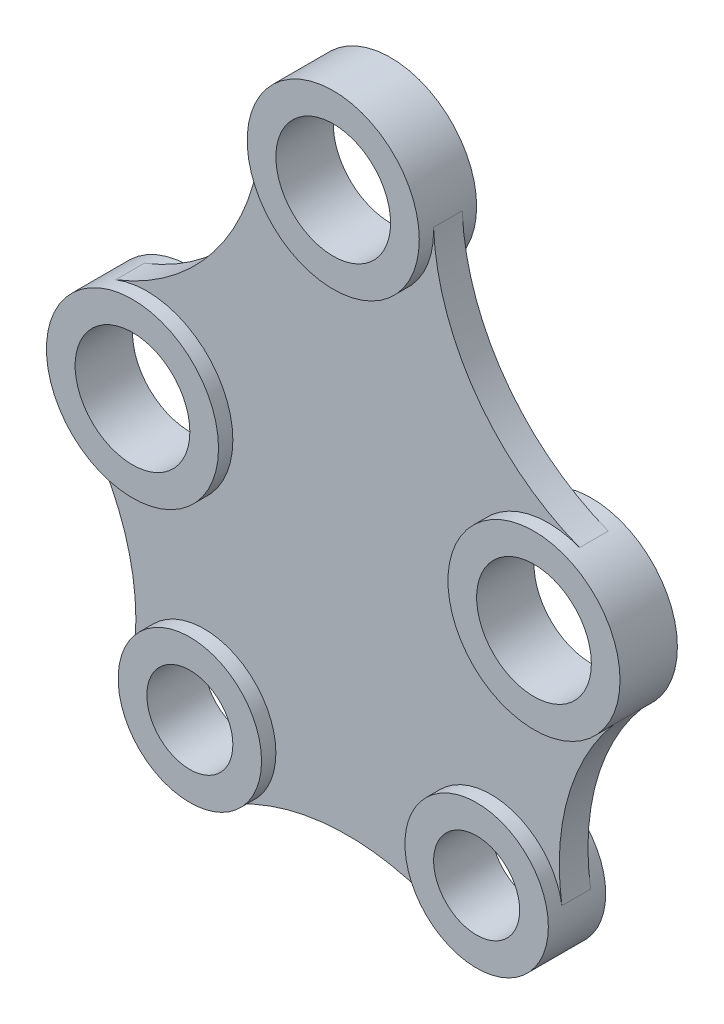
ISO-10303-21;
HEADER;
FILE_DESCRIPTION(('STEP AP214'),'2;1');
FILE_NAME('part.step','',(''),(''),'','','');
FILE_SCHEMA(('AUTOMOTIVE_DESIGN { 1 0 10303 214 1 1 1 1 }'));
ENDSEC;
DATA;
#1=APPLICATION_CONTEXT('core data for automotive mechanical design processes');
#2=APPLICATION_PROTOCOL_DEFINITION('international standard','automotive_design',2000,#1);
#3=PRODUCT_CONTEXT('',#1,'mechanical');
#4=PRODUCT('Part','Part','',(#3));
#5=PRODUCT_RELATED_PRODUCT_CATEGORY('part','',(#4));
#6=PRODUCT_DEFINITION_FORMATION('','',#4);
#7=PRODUCT_DEFINITION_CONTEXT('part definition',#1,'design');
#8=PRODUCT_DEFINITION('design','',#6,#7);
#9=PRODUCT_DEFINITION_SHAPE('','',#8);
#10=(LENGTH_UNIT() NAMED_UNIT(*) SI_UNIT(.MILLI.,.METRE.));
#11=(NAMED_UNIT(*) PLANE_ANGLE_UNIT() SI_UNIT($,.RADIAN.));
#12=(NAMED_UNIT(*) SI_UNIT($,.STERADIAN.) SOLID_ANGLE_UNIT());
#13=UNCERTAINTY_MEASURE_WITH_UNIT(LENGTH_MEASURE(1.E-05),#10,'distance_accuracy_value','');
#14=(GEOMETRIC_REPRESENTATION_CONTEXT(3) GLOBAL_UNCERTAINTY_ASSIGNED_CONTEXT((#13)) GLOBAL_UNIT_ASSIGNED_CONTEXT((#10,
#11,#12)) REPRESENTATION_CONTEXT('',''));
#15=CARTESIAN_POINT('',(0.,0.,0.));
#16=DIRECTION('',(0.,0.,1.));
#17=DIRECTION('',(1.,0.,0.));
#18=AXIS2_PLACEMENT_3D('',#15,#16,#17);
#19=CARTESIAN_POINT('',(0.,-179.330926563097,5.));
#20=DIRECTION('',(0.,0.,-1.));
#21=DIRECTION('',(-1.,0.,0.));
#22=AXIS2_PLACEMENT_3D('',#19,#20,#21);
#23=CYLINDRICAL_SURFACE('',#22,80.);
#24=CARTESIAN_POINT('',(0.,-179.330926563097,-5.));
#25=DIRECTION('',(0.,0.,1.));
#26=DIRECTION('',(1.,0.,0.));
#27=AXIS2_PLACEMENT_3D('',#24,#25,#26);
#28=CIRCLE('',#27,80.);
#29=CARTESIAN_POINT('',(-38.0952380952381,-108.983553943594,-5.));
#30=VERTEX_POINT('',#29);
#31=CARTESIAN_POINT('',(38.0952380952381,-108.983553943594,-5.));
#32=VERTEX_POINT('',#31);
#33=EDGE_CURVE('E131',#30,#32,#28,.F.);
#34=ORIENTED_EDGE('',*,*,#33,.T.);
#35=DIRECTION('',(0.,0.,-1.));
#36=VECTOR('',#35,1.);
#37=CARTESIAN_POINT('',(38.0952380952381,-108.983553943594,5.));
#38=LINE('',#37,#36);
#39=CARTESIAN_POINT('',(38.0952380952381,-108.983553943594,5.));
#40=VERTEX_POINT('',#39);
#41=EDGE_CURVE('E11',#40,#32,#38,.T.);
#42=ORIENTED_EDGE('',*,*,#41,.F.);
#43=CARTESIAN_POINT('',(0.,-179.330926563097,5.));
#44=DIRECTION('',(0.,0.,1.));
#45=DIRECTION('',(1.,0.,0.));
#46=AXIS2_PLACEMENT_3D('',#43,#44,#45);
#47=CIRCLE('',#46,80.);
#48=CARTESIAN_POINT('',(-38.0952380952381,-108.983553943594,5.));
#49=VERTEX_POINT('',#48);
#50=EDGE_CURVE('E162',#49,#40,#47,.F.);
#51=ORIENTED_EDGE('',*,*,#50,.F.);
#52=DIRECTION('',(0.,0.,-1.));
#53=VECTOR('',#52,1.);
#54=CARTESIAN_POINT('',(-38.0952380952381,-108.983553943594,5.));
#55=LINE('',#54,#53);
#56=EDGE_CURVE('E163',#49,#30,#55,.T.);
#57=ORIENTED_EDGE('',*,*,#56,.T.);
#58=EDGE_LOOP('',(#34,#42,#51,#57));
#59=FACE_BOUND('',#58,.T.);
#60=ADVANCED_FACE('F36',(#59),#23,.F.);
#61=CARTESIAN_POINT('',(153.811109020668,-71.2439331081997,5.));
#62=DIRECTION('',(0.,0.,-1.));
#63=DIRECTION('',(-1.,0.,0.));
#64=AXIS2_PLACEMENT_3D('',#61,#62,#63);
#65=CYLINDRICAL_SURFACE('',#64,80.);
#66=CARTESIAN_POINT('',(153.811109020668,-71.2439331081997,-5.));
#67=DIRECTION('',(0.,0.,1.));
#68=DIRECTION('',(1.,0.,0.));
#69=AXIS2_PLACEMENT_3D('',#66,#67,#68);
#70=CIRCLE('',#69,80.);
#71=CARTESIAN_POINT('',(92.8575751874551,-19.4301635749635,-5.));
#72=VERTEX_POINT('',#71);
#73=CARTESIAN_POINT('',(74.7169307192068,-83.2485555019523,-5.));
#74=VERTEX_POINT('',#73);
#75=EDGE_CURVE('E130',#72,#74,#70,.T.);
#76=ORIENTED_EDGE('',*,*,#75,.F.);
#77=DIRECTION('',(0.,0.,-1.));
#78=VECTOR('',#77,1.);
#79=CARTESIAN_POINT('',(92.8575751874551,-19.4301635749635,5.));
#80=LINE('',#79,#78);
#81=CARTESIAN_POINT('',(92.8575751874551,-19.4301635749636,5.));
#82=VERTEX_POINT('',#81);
#83=EDGE_CURVE('E141',#82,#72,#80,.T.);
#84=ORIENTED_EDGE('',*,*,#83,.F.);
#85=CARTESIAN_POINT('',(153.811109020668,-71.2439331081997,5.));
#86=DIRECTION('',(0.,0.,1.));
#87=DIRECTION('',(1.,0.,0.));
#88=AXIS2_PLACEMENT_3D('',#85,#86,#87);
#89=CIRCLE('',#88,80.);
#90=CARTESIAN_POINT('',(74.7169307192068,-83.2485555019523,5.));
#91=VERTEX_POINT('',#90);
#92=EDGE_CURVE('E140',#82,#91,#89,.T.);
#93=ORIENTED_EDGE('',*,*,#92,.T.);
#94=DIRECTION('',(0.,0.,-1.));
#95=VECTOR('',#94,1.);
#96=CARTESIAN_POINT('',(74.7169307192068,-83.2485555019523,5.));
#97=LINE('',#96,#95);
#98=EDGE_CURVE('E44',#91,#74,#97,.T.);
#99=ORIENTED_EDGE('',*,*,#98,.T.);
#100=EDGE_LOOP('',(#76,#84,#93,#99));
#101=FACE_BOUND('',#100,.T.);
#102=ADVANCED_FACE('F136',(#101),#65,.F.);
#103=CARTESIAN_POINT('',(109.907690941332,102.505493529523,5.));
#104=DIRECTION('',(0.,0.,-1.));
#105=DIRECTION('',(-1.,0.,0.));
#106=AXIS2_PLACEMENT_3D('',#103,#104,#105);
#107=CYLINDRICAL_SURFACE('',#106,80.);
#108=CARTESIAN_POINT('',(109.907690941332,102.505493529523,-5.));
#109=DIRECTION('',(0.,0.,1.));
#110=DIRECTION('',(1.,0.,0.));
#111=AXIS2_PLACEMENT_3D('',#108,#109,#110);
#112=CIRCLE('',#111,80.);
#113=CARTESIAN_POINT('',(29.9748248021815,99.2287709625972,-5.));
#114=VERTEX_POINT('',#113);
#115=CARTESIAN_POINT('',(80.8839157112725,27.9560436898699,-5.));
#116=VERTEX_POINT('',#115);
#117=EDGE_CURVE('E146',#114,#116,#112,.T.);
#118=ORIENTED_EDGE('',*,*,#117,.F.);
#119=DIRECTION('',(0.,0.,-1.));
#120=VECTOR('',#119,1.);
#121=CARTESIAN_POINT('',(29.9748248021815,99.2287709625972,5.));
#122=LINE('',#121,#120);
#123=CARTESIAN_POINT('',(29.9748248021815,99.2287709625972,5.));
#124=VERTEX_POINT('',#123);
#125=EDGE_CURVE('E176',#124,#114,#122,.T.);
#126=ORIENTED_EDGE('',*,*,#125,.F.);
#127=CARTESIAN_POINT('',(109.907690941332,102.505493529523,5.));
#128=DIRECTION('',(0.,0.,1.));
#129=DIRECTION('',(1.,0.,0.));
#130=AXIS2_PLACEMENT_3D('',#127,#128,#129);
#131=CIRCLE('',#130,80.);
#132=CARTESIAN_POINT('',(80.8839157112725,27.9560436898699,5.));
#133=VERTEX_POINT('',#132);
#134=EDGE_CURVE('E191',#124,#133,#131,.T.);
#135=ORIENTED_EDGE('',*,*,#134,.T.);
#136=DIRECTION('',(0.,0.,-1.));
#137=VECTOR('',#136,1.);
#138=CARTESIAN_POINT('',(80.8839157112725,27.9560436898699,5.));
#139=LINE('',#138,#137);
#140=EDGE_CURVE('E178',#133,#116,#139,.T.);
#141=ORIENTED_EDGE('',*,*,#140,.T.);
#142=EDGE_LOOP('',(#118,#126,#135,#141));
#143=FACE_BOUND('',#142,.T.);
#144=ADVANCED_FACE('F226',(#143),#107,.F.);
#145=CARTESIAN_POINT('',(-109.907690941332,102.505493529523,5.));
#146=DIRECTION('',(0.,0.,-1.));
#147=DIRECTION('',(-1.,0.,0.));
#148=AXIS2_PLACEMENT_3D('',#145,#146,#147);
#149=CYLINDRICAL_SURFACE('',#148,80.);
#150=CARTESIAN_POINT('',(-109.907690941332,102.505493529523,-5.));
#151=DIRECTION('',(0.,0.,1.));
#152=DIRECTION('',(1.,0.,0.));
#153=AXIS2_PLACEMENT_3D('',#150,#151,#152);
#154=CIRCLE('',#153,80.);
#155=CARTESIAN_POINT('',(-29.9748248021815,99.2287709625972,-5.));
#156=VERTEX_POINT('',#155);
#157=CARTESIAN_POINT('',(-80.8839157112725,27.9560436898699,-5.));
#158=VERTEX_POINT('',#157);
#159=EDGE_CURVE('E72',#156,#158,#154,.F.);
#160=ORIENTED_EDGE('',*,*,#159,.T.);
#161=DIRECTION('',(0.,0.,-1.));
#162=VECTOR('',#161,1.);
#163=CARTESIAN_POINT('',(-80.8839157112725,27.9560436898699,5.));
#164=LINE('',#163,#162);
#165=CARTESIAN_POINT('',(-80.8839157112725,27.9560436898699,5.));
#166=VERTEX_POINT('',#165);
#167=EDGE_CURVE('E171',#166,#158,#164,.T.);
#168=ORIENTED_EDGE('',*,*,#167,.F.);
#169=CARTESIAN_POINT('',(-109.907690941332,102.505493529523,5.));
#170=DIRECTION('',(0.,0.,1.));
#171=DIRECTION('',(1.,0.,0.));
#172=AXIS2_PLACEMENT_3D('',#169,#170,#171);
#173=CIRCLE('',#172,80.);
#174=CARTESIAN_POINT('',(-29.9748248021815,99.2287709625972,5.));
#175=VERTEX_POINT('',#174);
#176=EDGE_CURVE('E87',#175,#166,#173,.F.);
#177=ORIENTED_EDGE('',*,*,#176,.F.);
#178=DIRECTION('',(0.,0.,-1.));
#179=VECTOR('',#178,1.);
#180=CARTESIAN_POINT('',(-29.9748248021815,99.2287709625972,5.));
#181=LINE('',#180,#179);
#182=EDGE_CURVE('E174',#175,#156,#181,.T.);
#183=ORIENTED_EDGE('',*,*,#182,.T.);
#184=EDGE_LOOP('',(#160,#168,#177,#183));
#185=FACE_BOUND('',#184,.T.);
#186=ADVANCED_FACE('F230',(#185),#149,.F.);
#187=CARTESIAN_POINT('',(-153.811109020668,-71.2439331081997,5.));
#188=DIRECTION('',(0.,0.,-1.));
#189=DIRECTION('',(-1.,0.,0.));
#190=AXIS2_PLACEMENT_3D('',#187,#188,#189);
#191=CYLINDRICAL_SURFACE('',#190,80.);
#192=CARTESIAN_POINT('',(-153.811109020668,-71.2439331081997,-5.));
#193=DIRECTION('',(0.,0.,1.));
#194=DIRECTION('',(1.,0.,0.));
#195=AXIS2_PLACEMENT_3D('',#192,#193,#194);
#196=CIRCLE('',#195,80.);
#197=CARTESIAN_POINT('',(-92.8575751874551,-19.4301635749635,-5.));
#198=VERTEX_POINT('',#197);
#199=CARTESIAN_POINT('',(-74.7169307192068,-83.2485555019523,-5.));
#200=VERTEX_POINT('',#199);
#201=EDGE_CURVE('E80',#198,#200,#196,.F.);
#202=ORIENTED_EDGE('',*,*,#201,.T.);
#203=DIRECTION('',(0.,0.,-1.));
#204=VECTOR('',#203,1.);
#205=CARTESIAN_POINT('',(-74.7169307192068,-83.2485555019523,5.));
#206=LINE('',#205,#204);
#207=CARTESIAN_POINT('',(-74.7169307192068,-83.2485555019523,5.));
#208=VERTEX_POINT('',#207);
#209=EDGE_CURVE('E166',#208,#200,#206,.T.);
#210=ORIENTED_EDGE('',*,*,#209,.F.);
#211=CARTESIAN_POINT('',(-153.811109020668,-71.2439331081997,5.));
#212=DIRECTION('',(0.,0.,1.));
#213=DIRECTION('',(1.,0.,0.));
#214=AXIS2_PLACEMENT_3D('',#211,#212,#213);
#215=CIRCLE('',#214,80.);
#216=CARTESIAN_POINT('',(-92.8575751874551,-19.4301635749635,5.));
#217=VERTEX_POINT('',#216);
#218=EDGE_CURVE('E202',#217,#208,#215,.F.);
#219=ORIENTED_EDGE('',*,*,#218,.F.);
#220=DIRECTION('',(0.,0.,-1.));
#221=VECTOR('',#220,1.);
#222=CARTESIAN_POINT('',(-92.8575751874551,-19.4301635749635,5.));
#223=LINE('',#222,#221);
#224=EDGE_CURVE('E169',#217,#198,#223,.T.);
#225=ORIENTED_EDGE('',*,*,#224,.T.);
#226=EDGE_LOOP('',(#202,#210,#219,#225));
#227=FACE_BOUND('',#226,.T.);
#228=ADVANCED_FACE('F236',(#227),#191,.F.);
#229=CARTESIAN_POINT('',(0.,0.,5.));
#230=DIRECTION('',(0.,0.,1.));
#231=DIRECTION('',(1.,0.,0.));
#232=AXIS2_PLACEMENT_3D('',#229,#230,#231);
#233=PLANE('',#232);
#234=ORIENTED_EDGE('',*,*,#50,.T.);
#235=CARTESIAN_POINT('',(50.,-87.,5.));
#236=DIRECTION('',(0.,0.,1.));
#237=DIRECTION('',(1.,0.,0.));
#238=AXIS2_PLACEMENT_3D('',#235,#236,#237);
#239=CIRCLE('',#238,25.);
#240=EDGE_CURVE('E189',#91,#40,#239,.T.);
#241=ORIENTED_EDGE('',*,*,#240,.F.);
#242=ORIENTED_EDGE('',*,*,#92,.F.);
#243=CARTESIAN_POINT('',(70.,0.,5.));
#244=DIRECTION('',(0.,0.,1.));
#245=DIRECTION('',(1.,0.,0.));
#246=AXIS2_PLACEMENT_3D('',#243,#244,#245);
#247=CIRCLE('',#246,30.);
#248=EDGE_CURVE('E185',#133,#82,#247,.T.);
#249=ORIENTED_EDGE('',*,*,#248,.F.);
#250=ORIENTED_EDGE('',*,*,#134,.F.);
#251=CARTESIAN_POINT('',(0.,98.,5.));
#252=DIRECTION('',(0.,0.,1.));
#253=DIRECTION('',(1.,0.,0.));
#254=AXIS2_PLACEMENT_3D('',#251,#252,#253);
#255=CIRCLE('',#254,30.);
#256=EDGE_CURVE('E197',#175,#124,#255,.T.);
#257=ORIENTED_EDGE('',*,*,#256,.F.);
#258=ORIENTED_EDGE('',*,*,#176,.T.);
#259=CARTESIAN_POINT('',(-70.,0.,5.));
#260=DIRECTION('',(0.,0.,1.));
#261=DIRECTION('',(1.,0.,0.));
#262=AXIS2_PLACEMENT_3D('',#259,#260,#261);
#263=CIRCLE('',#262,30.);
#264=EDGE_CURVE('E200',#166,#217,#263,.F.);
#265=ORIENTED_EDGE('',*,*,#264,.T.);
#266=ORIENTED_EDGE('',*,*,#218,.T.);
#267=CARTESIAN_POINT('',(-50.,-87.,5.));
#268=DIRECTION('',(0.,0.,1.));
#269=DIRECTION('',(1.,0.,0.));
#270=AXIS2_PLACEMENT_3D('',#267,#268,#269);
#271=CIRCLE('',#270,25.);
#272=EDGE_CURVE('E52',#208,#49,#271,.F.);
#273=ORIENTED_EDGE('',*,*,#272,.T.);
#274=EDGE_LOOP('',(#234,#241,#242,#249,#250,#257,#258,#265,#266,#273));
#275=FACE_BOUND('',#274,.T.);
#276=ADVANCED_FACE('F186',(#275),#233,.T.);
#277=CARTESIAN_POINT('',(0.,0.,-5.));
#278=DIRECTION('',(0.,0.,1.));
#279=DIRECTION('',(1.,0.,0.));
#280=AXIS2_PLACEMENT_3D('',#277,#278,#279);
#281=PLANE('',#280);
#282=ORIENTED_EDGE('',*,*,#33,.F.);
#283=CARTESIAN_POINT('',(-50.,-87.,-5.));
#284=DIRECTION('',(0.,0.,1.));
#285=DIRECTION('',(1.,0.,0.));
#286=AXIS2_PLACEMENT_3D('',#283,#284,#285);
#287=CIRCLE('',#286,25.);
#288=EDGE_CURVE('E159',#200,#30,#287,.F.);
#289=ORIENTED_EDGE('',*,*,#288,.F.);
#290=ORIENTED_EDGE('',*,*,#201,.F.);
#291=CARTESIAN_POINT('',(-70.,0.,-5.));
#292=DIRECTION('',(0.,0.,1.));
#293=DIRECTION('',(1.,0.,0.));
#294=AXIS2_PLACEMENT_3D('',#291,#292,#293);
#295=CIRCLE('',#294,30.);
#296=EDGE_CURVE('E155',#158,#198,#295,.F.);
#297=ORIENTED_EDGE('',*,*,#296,.F.);
#298=ORIENTED_EDGE('',*,*,#159,.F.);
#299=CARTESIAN_POINT('',(0.,98.,-5.));
#300=DIRECTION('',(0.,0.,1.));
#301=DIRECTION('',(1.,0.,0.));
#302=AXIS2_PLACEMENT_3D('',#299,#300,#301);
#303=CIRCLE('',#302,30.);
#304=EDGE_CURVE('E151',#156,#114,#303,.T.);
#305=ORIENTED_EDGE('',*,*,#304,.T.);
#306=ORIENTED_EDGE('',*,*,#117,.T.);
#307=CARTESIAN_POINT('',(70.,0.,-5.));
#308=DIRECTION('',(0.,0.,1.));
#309=DIRECTION('',(1.,0.,0.));
#310=AXIS2_PLACEMENT_3D('',#307,#308,#309);
#311=CIRCLE('',#310,30.);
#312=EDGE_CURVE('E144',#116,#72,#311,.T.);
#313=ORIENTED_EDGE('',*,*,#312,.T.);
#314=ORIENTED_EDGE('',*,*,#75,.T.);
#315=CARTESIAN_POINT('',(50.,-87.,-5.));
#316=DIRECTION('',(0.,0.,1.));
#317=DIRECTION('',(1.,0.,0.));
#318=AXIS2_PLACEMENT_3D('',#315,#316,#317);
#319=CIRCLE('',#318,25.);
#320=EDGE_CURVE('E121',#74,#32,#319,.T.);
#321=ORIENTED_EDGE('',*,*,#320,.T.);
#322=EDGE_LOOP('',(#282,#289,#290,#297,#298,#305,#306,#313,#314,#321));
#323=FACE_BOUND('',#322,.T.);
#324=ADVANCED_FACE('F142',(#323),#281,.F.);
#325=CARTESIAN_POINT('',(0.,98.,10.));
#326=DIRECTION('',(0.,0.,-1.));
#327=DIRECTION('',(-1.,0.,0.));
#328=AXIS2_PLACEMENT_3D('',#325,#326,#327);
#329=CYLINDRICAL_SURFACE('',#328,20.);
#330=CARTESIAN_POINT('',(0.,98.,10.));
#331=DIRECTION('',(0.,0.,1.));
#332=DIRECTION('',(1.,0.,0.));
#333=AXIS2_PLACEMENT_3D('',#330,#331,#332);
#334=CIRCLE('',#333,20.);
#335=CARTESIAN_POINT('',(20.,98.,10.));
#336=VERTEX_POINT('',#335);
#337=EDGE_CURVE('E207',#336,#336,#334,.T.);
#338=ORIENTED_EDGE('',*,*,#337,.T.);
#339=EDGE_LOOP('',(#338));
#340=FACE_BOUND('',#339,.T.);
#341=CARTESIAN_POINT('',(0.,98.,-10.));
#342=DIRECTION('',(0.,0.,1.));
#343=DIRECTION('',(1.,0.,0.));
#344=AXIS2_PLACEMENT_3D('',#341,#342,#343);
#345=CIRCLE('',#344,20.);
#346=CARTESIAN_POINT('',(20.,98.,-10.));
#347=VERTEX_POINT('',#346);
#348=EDGE_CURVE('E216',#347,#347,#345,.T.);
#349=ORIENTED_EDGE('',*,*,#348,.F.);
#350=EDGE_LOOP('',(#349));
#351=FACE_BOUND('',#350,.T.);
#352=ADVANCED_FACE('F241',(#340,#351),#329,.F.);
#353=CARTESIAN_POINT('',(0.,98.,10.));
#354=DIRECTION('',(0.,0.,-1.));
#355=DIRECTION('',(-1.,0.,0.));
#356=AXIS2_PLACEMENT_3D('',#353,#354,#355);
#357=CYLINDRICAL_SURFACE('',#356,30.);
#358=ORIENTED_EDGE('',*,*,#256,.T.);
#359=ORIENTED_EDGE('',*,*,#125,.T.);
#360=ORIENTED_EDGE('',*,*,#304,.F.);
#361=ORIENTED_EDGE('',*,*,#182,.F.);
#362=EDGE_LOOP('',(#358,#359,#360,#361));
#363=FACE_BOUND('',#362,.T.);
#364=CARTESIAN_POINT('',(0.,98.,10.));
#365=DIRECTION('',(0.,0.,1.));
#366=DIRECTION('',(1.,0.,0.));
#367=AXIS2_PLACEMENT_3D('',#364,#365,#366);
#368=CIRCLE('',#367,30.);
#369=CARTESIAN_POINT('',(30.,98.,10.));
#370=VERTEX_POINT('',#369);
#371=EDGE_CURVE('E204',#370,#370,#368,.T.);
#372=ORIENTED_EDGE('',*,*,#371,.F.);
#373=EDGE_LOOP('',(#372));
#374=FACE_BOUND('',#373,.T.);
#375=CARTESIAN_POINT('',(0.,98.,-10.));
#376=DIRECTION('',(0.,0.,1.));
#377=DIRECTION('',(1.,0.,0.));
#378=AXIS2_PLACEMENT_3D('',#375,#376,#377);
#379=CIRCLE('',#378,30.);
#380=CARTESIAN_POINT('',(30.,98.,-10.));
#381=VERTEX_POINT('',#380);
#382=EDGE_CURVE('E212',#381,#381,#379,.T.);
#383=ORIENTED_EDGE('',*,*,#382,.T.);
#384=EDGE_LOOP('',(#383));
#385=FACE_BOUND('',#384,.T.);
#386=ADVANCED_FACE('F246',(#363,#374,#385),#357,.T.);
#387=CARTESIAN_POINT('',(0.,0.,10.));
#388=DIRECTION('',(0.,0.,1.));
#389=DIRECTION('',(1.,0.,0.));
#390=AXIS2_PLACEMENT_3D('',#387,#388,#389);
#391=PLANE('',#390);
#392=ORIENTED_EDGE('',*,*,#337,.F.);
#393=EDGE_LOOP('',(#392));
#394=FACE_BOUND('',#393,.T.);
#395=ORIENTED_EDGE('',*,*,#371,.T.);
#396=EDGE_LOOP('',(#395));
#397=FACE_BOUND('',#396,.T.);
#398=ADVANCED_FACE('F250',(#394,#397),#391,.T.);
#399=CARTESIAN_POINT('',(0.,0.,-10.));
#400=DIRECTION('',(0.,0.,1.));
#401=DIRECTION('',(1.,0.,0.));
#402=AXIS2_PLACEMENT_3D('',#399,#400,#401);
#403=PLANE('',#402);
#404=ORIENTED_EDGE('',*,*,#348,.T.);
#405=EDGE_LOOP('',(#404));
#406=FACE_BOUND('',#405,.T.);
#407=ORIENTED_EDGE('',*,*,#382,.F.);
#408=EDGE_LOOP('',(#407));
#409=FACE_BOUND('',#408,.T.);
#410=ADVANCED_FACE('F252',(#406,#409),#403,.F.);
#411=CARTESIAN_POINT('',(70.,0.,10.));
#412=DIRECTION('',(0.,0.,-1.));
#413=DIRECTION('',(-1.,0.,0.));
#414=AXIS2_PLACEMENT_3D('',#411,#412,#413);
#415=CYLINDRICAL_SURFACE('',#414,20.);
#416=CARTESIAN_POINT('',(70.,0.,10.));
#417=DIRECTION('',(0.,0.,1.));
#418=DIRECTION('',(1.,0.,0.));
#419=AXIS2_PLACEMENT_3D('',#416,#417,#418);
#420=CIRCLE('',#419,20.);
#421=CARTESIAN_POINT('',(90.,0.,10.));
#422=VERTEX_POINT('',#421);
#423=EDGE_CURVE('E361',#422,#422,#420,.T.);
#424=ORIENTED_EDGE('',*,*,#423,.T.);
#425=EDGE_LOOP('',(#424));
#426=FACE_BOUND('',#425,.T.);
#427=CARTESIAN_POINT('',(70.,0.,-10.));
#428=DIRECTION('',(0.,0.,1.));
#429=DIRECTION('',(1.,0.,0.));
#430=AXIS2_PLACEMENT_3D('',#427,#428,#429);
#431=CIRCLE('',#430,20.);
#432=CARTESIAN_POINT('',(90.,0.,-10.));
#433=VERTEX_POINT('',#432);
#434=EDGE_CURVE('E356',#433,#433,#431,.T.);
#435=ORIENTED_EDGE('',*,*,#434,.F.);
#436=EDGE_LOOP('',(#435));
#437=FACE_BOUND('',#436,.T.);
#438=ADVANCED_FACE('F255',(#426,#437),#415,.F.);
#439=CARTESIAN_POINT('',(70.,0.,10.));
#440=DIRECTION('',(0.,0.,-1.));
#441=DIRECTION('',(-1.,0.,0.));
#442=AXIS2_PLACEMENT_3D('',#439,#440,#441);
#443=CYLINDRICAL_SURFACE('',#442,30.);
#444=ORIENTED_EDGE('',*,*,#248,.T.);
#445=ORIENTED_EDGE('',*,*,#83,.T.);
#446=ORIENTED_EDGE('',*,*,#312,.F.);
#447=ORIENTED_EDGE('',*,*,#140,.F.);
#448=EDGE_LOOP('',(#444,#445,#446,#447));
#449=FACE_BOUND('',#448,.T.);
#450=CARTESIAN_POINT('',(70.,0.,10.));
#451=DIRECTION('',(0.,0.,1.));
#452=DIRECTION('',(1.,0.,0.));
#453=AXIS2_PLACEMENT_3D('',#450,#451,#452);
#454=CIRCLE('',#453,30.);
#455=CARTESIAN_POINT('',(100.,0.,10.));
#456=VERTEX_POINT('',#455);
#457=EDGE_CURVE('E219',#456,#456,#454,.T.);
#458=ORIENTED_EDGE('',*,*,#457,.F.);
#459=EDGE_LOOP('',(#458));
#460=FACE_BOUND('',#459,.T.);
#461=CARTESIAN_POINT('',(70.,0.,-10.));
#462=DIRECTION('',(0.,0.,1.));
#463=DIRECTION('',(1.,0.,0.));
#464=AXIS2_PLACEMENT_3D('',#461,#462,#463);
#465=CIRCLE('',#464,30.);
#466=CARTESIAN_POINT('',(100.,0.,-10.));
#467=VERTEX_POINT('',#466);
#468=EDGE_CURVE('E364',#467,#467,#465,.T.);
#469=ORIENTED_EDGE('',*,*,#468,.T.);
#470=EDGE_LOOP('',(#469));
#471=FACE_BOUND('',#470,.T.);
#472=ADVANCED_FACE('F182',(#449,#460,#471),#443,.T.);
#473=CARTESIAN_POINT('',(0.,0.,10.));
#474=DIRECTION('',(0.,0.,1.));
#475=DIRECTION('',(1.,0.,0.));
#476=AXIS2_PLACEMENT_3D('',#473,#474,#475);
#477=PLANE('',#476);
#478=ORIENTED_EDGE('',*,*,#423,.F.);
#479=EDGE_LOOP('',(#478));
#480=FACE_BOUND('',#479,.T.);
#481=ORIENTED_EDGE('',*,*,#457,.T.);
#482=EDGE_LOOP('',(#481));
#483=FACE_BOUND('',#482,.T.);
#484=ADVANCED_FACE('F265',(#480,#483),#477,.T.);
#485=CARTESIAN_POINT('',(0.,0.,-10.));
#486=DIRECTION('',(0.,0.,1.));
#487=DIRECTION('',(1.,0.,0.));
#488=AXIS2_PLACEMENT_3D('',#485,#486,#487);
#489=PLANE('',#488);
#490=ORIENTED_EDGE('',*,*,#434,.T.);
#491=EDGE_LOOP('',(#490));
#492=FACE_BOUND('',#491,.T.);
#493=ORIENTED_EDGE('',*,*,#468,.F.);
#494=EDGE_LOOP('',(#493));
#495=FACE_BOUND('',#494,.T.);
#496=ADVANCED_FACE('F266',(#492,#495),#489,.F.);
#497=CARTESIAN_POINT('',(-70.,0.,10.));
#498=DIRECTION('',(0.,0.,-1.));
#499=DIRECTION('',(-1.,0.,0.));
#500=AXIS2_PLACEMENT_3D('',#497,#498,#499);
#501=CYLINDRICAL_SURFACE('',#500,30.);
#502=ORIENTED_EDGE('',*,*,#224,.F.);
#503=ORIENTED_EDGE('',*,*,#264,.F.);
#504=ORIENTED_EDGE('',*,*,#167,.T.);
#505=ORIENTED_EDGE('',*,*,#296,.T.);
#506=EDGE_LOOP('',(#502,#503,#504,#505));
#507=FACE_BOUND('',#506,.T.);
#508=CARTESIAN_POINT('',(-70.,0.,10.));
#509=DIRECTION('',(0.,0.,1.));
#510=DIRECTION('',(1.,0.,0.));
#511=AXIS2_PLACEMENT_3D('',#508,#509,#510);
#512=CIRCLE('',#511,30.);
#513=CARTESIAN_POINT('',(-40.,0.,10.));
#514=VERTEX_POINT('',#513);
#515=EDGE_CURVE('E349',#514,#514,#512,.F.);
#516=ORIENTED_EDGE('',*,*,#515,.T.);
#517=EDGE_LOOP('',(#516));
#518=FACE_BOUND('',#517,.T.);
#519=CARTESIAN_POINT('',(-70.,0.,-10.));
#520=DIRECTION('',(0.,0.,1.));
#521=DIRECTION('',(1.,0.,0.));
#522=AXIS2_PLACEMENT_3D('',#519,#520,#521);
#523=CIRCLE('',#522,30.);
#524=CARTESIAN_POINT('',(-40.,0.,-10.));
#525=VERTEX_POINT('',#524);
#526=EDGE_CURVE('E345',#525,#525,#523,.F.);
#527=ORIENTED_EDGE('',*,*,#526,.F.);
#528=EDGE_LOOP('',(#527));
#529=FACE_BOUND('',#528,.T.);
#530=ADVANCED_FACE('F269',(#507,#518,#529),#501,.T.);
#531=CARTESIAN_POINT('',(-70.,0.,10.));
#532=DIRECTION('',(0.,0.,-1.));
#533=DIRECTION('',(-1.,0.,0.));
#534=AXIS2_PLACEMENT_3D('',#531,#532,#533);
#535=CYLINDRICAL_SURFACE('',#534,20.);
#536=CARTESIAN_POINT('',(-70.,0.,10.));
#537=DIRECTION('',(0.,0.,1.));
#538=DIRECTION('',(1.,0.,0.));
#539=AXIS2_PLACEMENT_3D('',#536,#537,#538);
#540=CIRCLE('',#539,20.);
#541=CARTESIAN_POINT('',(-50.,0.,10.));
#542=VERTEX_POINT('',#541);
#543=EDGE_CURVE('E352',#542,#542,#540,.F.);
#544=ORIENTED_EDGE('',*,*,#543,.F.);
#545=EDGE_LOOP('',(#544));
#546=FACE_BOUND('',#545,.T.);
#547=CARTESIAN_POINT('',(-70.,0.,-10.));
#548=DIRECTION('',(0.,0.,1.));
#549=DIRECTION('',(1.,0.,0.));
#550=AXIS2_PLACEMENT_3D('',#547,#548,#549);
#551=CIRCLE('',#550,20.);
#552=CARTESIAN_POINT('',(-50.,0.,-10.));
#553=VERTEX_POINT('',#552);
#554=EDGE_CURVE('E353',#553,#553,#551,.F.);
#555=ORIENTED_EDGE('',*,*,#554,.T.);
#556=EDGE_LOOP('',(#555));
#557=FACE_BOUND('',#556,.T.);
#558=ADVANCED_FACE('F276',(#546,#557),#535,.F.);
#559=CARTESIAN_POINT('',(0.,0.,10.));
#560=DIRECTION('',(0.,0.,1.));
#561=DIRECTION('',(1.,0.,0.));
#562=AXIS2_PLACEMENT_3D('',#559,#560,#561);
#563=PLANE('',#562);
#564=ORIENTED_EDGE('',*,*,#515,.F.);
#565=EDGE_LOOP('',(#564));
#566=FACE_BOUND('',#565,.T.);
#567=ORIENTED_EDGE('',*,*,#543,.T.);
#568=EDGE_LOOP('',(#567));
#569=FACE_BOUND('',#568,.T.);
#570=ADVANCED_FACE('F280',(#566,#569),#563,.T.);
#571=CARTESIAN_POINT('',(0.,0.,-10.));
#572=DIRECTION('',(0.,0.,1.));
#573=DIRECTION('',(1.,0.,0.));
#574=AXIS2_PLACEMENT_3D('',#571,#572,#573);
#575=PLANE('',#574);
#576=ORIENTED_EDGE('',*,*,#526,.T.);
#577=EDGE_LOOP('',(#576));
#578=FACE_BOUND('',#577,.T.);
#579=ORIENTED_EDGE('',*,*,#554,.F.);
#580=EDGE_LOOP('',(#579));
#581=FACE_BOUND('',#580,.T.);
#582=ADVANCED_FACE('F282',(#578,#581),#575,.F.);
#583=CARTESIAN_POINT('',(-50.,-87.,10.));
#584=DIRECTION('',(0.,0.,-1.));
#585=DIRECTION('',(-1.,0.,0.));
#586=AXIS2_PLACEMENT_3D('',#583,#584,#585);
#587=CYLINDRICAL_SURFACE('',#586,25.);
#588=ORIENTED_EDGE('',*,*,#56,.F.);
#589=ORIENTED_EDGE('',*,*,#272,.F.);
#590=ORIENTED_EDGE('',*,*,#209,.T.);
#591=ORIENTED_EDGE('',*,*,#288,.T.);
#592=EDGE_LOOP('',(#588,#589,#590,#591));
#593=FACE_BOUND('',#592,.T.);
#594=CARTESIAN_POINT('',(-50.,-87.,10.));
#595=DIRECTION('',(0.,0.,1.));
#596=DIRECTION('',(1.,0.,0.));
#597=AXIS2_PLACEMENT_3D('',#594,#595,#596);
#598=CIRCLE('',#597,25.);
#599=CARTESIAN_POINT('',(-25.,-87.,10.));
#600=VERTEX_POINT('',#599);
#601=EDGE_CURVE('E340',#600,#600,#598,.F.);
#602=ORIENTED_EDGE('',*,*,#601,.T.);
#603=EDGE_LOOP('',(#602));
#604=FACE_BOUND('',#603,.T.);
#605=CARTESIAN_POINT('',(-50.,-87.,-10.));
#606=DIRECTION('',(0.,0.,1.));
#607=DIRECTION('',(1.,0.,0.));
#608=AXIS2_PLACEMENT_3D('',#605,#606,#607);
#609=CIRCLE('',#608,25.);
#610=CARTESIAN_POINT('',(-25.,-87.,-10.));
#611=VERTEX_POINT('',#610);
#612=EDGE_CURVE('E327',#611,#611,#609,.F.);
#613=ORIENTED_EDGE('',*,*,#612,.F.);
#614=EDGE_LOOP('',(#613));
#615=FACE_BOUND('',#614,.T.);
#616=ADVANCED_FACE('F285',(#593,#604,#615),#587,.T.);
#617=CARTESIAN_POINT('',(-50.,-87.,10.));
#618=DIRECTION('',(0.,0.,-1.));
#619=DIRECTION('',(-1.,0.,0.));
#620=AXIS2_PLACEMENT_3D('',#617,#618,#619);
#621=CYLINDRICAL_SURFACE('',#620,15.);
#622=CARTESIAN_POINT('',(-50.,-87.,10.));
#623=DIRECTION('',(0.,0.,1.));
#624=DIRECTION('',(1.,0.,0.));
#625=AXIS2_PLACEMENT_3D('',#622,#623,#624);
#626=CIRCLE('',#625,15.);
#627=CARTESIAN_POINT('',(-35.,-87.,10.));
#628=VERTEX_POINT('',#627);
#629=EDGE_CURVE('E343',#628,#628,#626,.F.);
#630=ORIENTED_EDGE('',*,*,#629,.F.);
#631=EDGE_LOOP('',(#630));
#632=FACE_BOUND('',#631,.T.);
#633=CARTESIAN_POINT('',(-50.,-87.,-10.));
#634=DIRECTION('',(0.,0.,1.));
#635=DIRECTION('',(1.,0.,0.));
#636=AXIS2_PLACEMENT_3D('',#633,#634,#635);
#637=CIRCLE('',#636,15.);
#638=CARTESIAN_POINT('',(-35.,-87.,-10.));
#639=VERTEX_POINT('',#638);
#640=EDGE_CURVE('E330',#639,#639,#637,.F.);
#641=ORIENTED_EDGE('',*,*,#640,.T.);
#642=EDGE_LOOP('',(#641));
#643=FACE_BOUND('',#642,.T.);
#644=ADVANCED_FACE('F292',(#632,#643),#621,.F.);
#645=CARTESIAN_POINT('',(0.,0.,10.));
#646=DIRECTION('',(0.,0.,1.));
#647=DIRECTION('',(1.,0.,0.));
#648=AXIS2_PLACEMENT_3D('',#645,#646,#647);
#649=PLANE('',#648);
#650=ORIENTED_EDGE('',*,*,#601,.F.);
#651=EDGE_LOOP('',(#650));
#652=FACE_BOUND('',#651,.T.);
#653=ORIENTED_EDGE('',*,*,#629,.T.);
#654=EDGE_LOOP('',(#653));
#655=FACE_BOUND('',#654,.T.);
#656=ADVANCED_FACE('F296',(#652,#655),#649,.T.);
#657=CARTESIAN_POINT('',(0.,0.,-10.));
#658=DIRECTION('',(0.,0.,1.));
#659=DIRECTION('',(1.,0.,0.));
#660=AXIS2_PLACEMENT_3D('',#657,#658,#659);
#661=PLANE('',#660);
#662=ORIENTED_EDGE('',*,*,#612,.T.);
#663=EDGE_LOOP('',(#662));
#664=FACE_BOUND('',#663,.T.);
#665=ORIENTED_EDGE('',*,*,#640,.F.);
#666=EDGE_LOOP('',(#665));
#667=FACE_BOUND('',#666,.T.);
#668=ADVANCED_FACE('F298',(#664,#667),#661,.F.);
#669=CARTESIAN_POINT('',(50.,-87.,10.));
#670=DIRECTION('',(0.,0.,-1.));
#671=DIRECTION('',(-1.,0.,0.));
#672=AXIS2_PLACEMENT_3D('',#669,#670,#671);
#673=CYLINDRICAL_SURFACE('',#672,15.);
#674=CARTESIAN_POINT('',(50.,-87.,10.));
#675=DIRECTION('',(0.,0.,1.));
#676=DIRECTION('',(1.,0.,0.));
#677=AXIS2_PLACEMENT_3D('',#674,#675,#676);
#678=CIRCLE('',#677,15.);
#679=CARTESIAN_POINT('',(65.,-87.,10.));
#680=VERTEX_POINT('',#679);
#681=EDGE_CURVE('E323',#680,#680,#678,.T.);
#682=ORIENTED_EDGE('',*,*,#681,.T.);
#683=EDGE_LOOP('',(#682));
#684=FACE_BOUND('',#683,.T.);
#685=CARTESIAN_POINT('',(50.,-87.,-10.));
#686=DIRECTION('',(0.,0.,1.));
#687=DIRECTION('',(1.,0.,0.));
#688=AXIS2_PLACEMENT_3D('',#685,#686,#687);
#689=CIRCLE('',#688,15.);
#690=CARTESIAN_POINT('',(65.,-87.,-10.));
#691=VERTEX_POINT('',#690);
#692=EDGE_CURVE('E335',#691,#691,#689,.T.);
#693=ORIENTED_EDGE('',*,*,#692,.F.);
#694=EDGE_LOOP('',(#693));
#695=FACE_BOUND('',#694,.T.);
#696=ADVANCED_FACE('F301',(#684,#695),#673,.F.);
#697=CARTESIAN_POINT('',(50.,-87.,10.));
#698=DIRECTION('',(0.,0.,-1.));
#699=DIRECTION('',(-1.,0.,0.));
#700=AXIS2_PLACEMENT_3D('',#697,#698,#699);
#701=CYLINDRICAL_SURFACE('',#700,25.);
#702=ORIENTED_EDGE('',*,*,#240,.T.);
#703=ORIENTED_EDGE('',*,*,#41,.T.);
#704=ORIENTED_EDGE('',*,*,#320,.F.);
#705=ORIENTED_EDGE('',*,*,#98,.F.);
#706=EDGE_LOOP('',(#702,#703,#704,#705));
#707=FACE_BOUND('',#706,.T.);
#708=CARTESIAN_POINT('',(50.,-87.,10.));
#709=DIRECTION('',(0.,0.,1.));
#710=DIRECTION('',(1.,0.,0.));
#711=AXIS2_PLACEMENT_3D('',#708,#709,#710);
#712=CIRCLE('',#711,25.);
#713=CARTESIAN_POINT('',(75.,-87.,10.));
#714=VERTEX_POINT('',#713);
#715=EDGE_CURVE('E326',#714,#714,#712,.T.);
#716=ORIENTED_EDGE('',*,*,#715,.F.);
#717=EDGE_LOOP('',(#716));
#718=FACE_BOUND('',#717,.T.);
#719=CARTESIAN_POINT('',(50.,-87.,-10.));
#720=DIRECTION('',(0.,0.,1.));
#721=DIRECTION('',(1.,0.,0.));
#722=AXIS2_PLACEMENT_3D('',#719,#720,#721);
#723=CIRCLE('',#722,25.);
#724=CARTESIAN_POINT('',(75.,-87.,-10.));
#725=VERTEX_POINT('',#724);
#726=EDGE_CURVE('E332',#725,#725,#723,.T.);
#727=ORIENTED_EDGE('',*,*,#726,.T.);
#728=EDGE_LOOP('',(#727));
#729=FACE_BOUND('',#728,.T.);
#730=ADVANCED_FACE('F123',(#707,#718,#729),#701,.T.);
#731=CARTESIAN_POINT('',(0.,0.,10.));
#732=DIRECTION('',(0.,0.,1.));
#733=DIRECTION('',(1.,0.,0.));
#734=AXIS2_PLACEMENT_3D('',#731,#732,#733);
#735=PLANE('',#734);
#736=ORIENTED_EDGE('',*,*,#681,.F.);
#737=EDGE_LOOP('',(#736));
#738=FACE_BOUND('',#737,.T.);
#739=ORIENTED_EDGE('',*,*,#715,.T.);
#740=EDGE_LOOP('',(#739));
#741=FACE_BOUND('',#740,.T.);
#742=ADVANCED_FACE('F311',(#738,#741),#735,.T.);
#743=CARTESIAN_POINT('',(0.,0.,-10.));
#744=DIRECTION('',(0.,0.,1.));
#745=DIRECTION('',(1.,0.,0.));
#746=AXIS2_PLACEMENT_3D('',#743,#744,#745);
#747=PLANE('',#746);
#748=ORIENTED_EDGE('',*,*,#692,.T.);
#749=EDGE_LOOP('',(#748));
#750=FACE_BOUND('',#749,.T.);
#751=ORIENTED_EDGE('',*,*,#726,.F.);
#752=EDGE_LOOP('',(#751));
#753=FACE_BOUND('',#752,.T.);
#754=ADVANCED_FACE('F312',(#750,#753),#747,.F.);
#755=CLOSED_SHELL('',(#60,#102,#144,#186,#228,#276,#324,#352,#386,#398,#410,#438,#472,#484,#496,
#530,#558,#570,#582,#616,#644,#656,#668,#696,#730,#742,#754));
#756=MANIFOLD_SOLID_BREP('B2',#755);
#757=ADVANCED_BREP_SHAPE_REPRESENTATION('',(#18,#756),#14);
#758=SHAPE_DEFINITION_REPRESENTATION(#9,#757);
ENDSEC;
END-ISO-10303-21;
